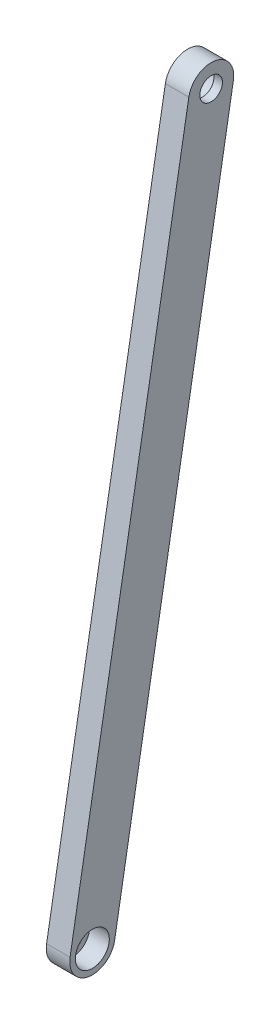
ISO-10303-21;
HEADER;
FILE_DESCRIPTION(('STEP AP214'),'2;1');
FILE_NAME('part.step','',(''),(''),'','','');
FILE_SCHEMA(('AUTOMOTIVE_DESIGN { 1 0 10303 214 1 1 1 1 }'));
ENDSEC;
DATA;
#1=APPLICATION_CONTEXT('core data for automotive mechanical design processes');
#2=APPLICATION_PROTOCOL_DEFINITION('international standard','automotive_design',2000,#1);
#3=PRODUCT_CONTEXT('',#1,'mechanical');
#4=PRODUCT('Part','Part','',(#3));
#5=PRODUCT_RELATED_PRODUCT_CATEGORY('part','',(#4));
#6=PRODUCT_DEFINITION_FORMATION('','',#4);
#7=PRODUCT_DEFINITION_CONTEXT('part definition',#1,'design');
#8=PRODUCT_DEFINITION('design','',#6,#7);
#9=PRODUCT_DEFINITION_SHAPE('','',#8);
#10=(LENGTH_UNIT() NAMED_UNIT(*) SI_UNIT(.MILLI.,.METRE.));
#11=(NAMED_UNIT(*) PLANE_ANGLE_UNIT() SI_UNIT($,.RADIAN.));
#12=(NAMED_UNIT(*) SI_UNIT($,.STERADIAN.) SOLID_ANGLE_UNIT());
#13=UNCERTAINTY_MEASURE_WITH_UNIT(LENGTH_MEASURE(1.E-05),#10,'distance_accuracy_value','');
#14=(GEOMETRIC_REPRESENTATION_CONTEXT(3) GLOBAL_UNCERTAINTY_ASSIGNED_CONTEXT((#13)) GLOBAL_UNIT_ASSIGNED_CONTEXT((#10,
#11,#12)) REPRESENTATION_CONTEXT('',''));
#15=CARTESIAN_POINT('',(0.,0.,0.));
#16=DIRECTION('',(0.,0.,1.));
#17=DIRECTION('',(1.,0.,0.));
#18=AXIS2_PLACEMENT_3D('',#15,#16,#17);
#19=CARTESIAN_POINT('',(-15.5,0.,0.));
#20=DIRECTION('',(1.,0.,0.));
#21=DIRECTION('',(0.,0.,-1.));
#22=AXIS2_PLACEMENT_3D('',#19,#20,#21);
#23=CYLINDRICAL_SURFACE('',#22,2.);
#24=CARTESIAN_POINT('',(-15.5,0.,0.));
#25=DIRECTION('',(1.,0.,0.));
#26=DIRECTION('',(0.,0.,-1.));
#27=AXIS2_PLACEMENT_3D('',#24,#25,#26);
#28=CIRCLE('',#27,2.);
#29=CARTESIAN_POINT('',(-15.5,0.,-2.));
#30=VERTEX_POINT('',#29);
#31=EDGE_CURVE('E106',#30,#30,#28,.T.);
#32=ORIENTED_EDGE('',*,*,#31,.F.);
#33=EDGE_LOOP('',(#32));
#34=FACE_BOUND('',#33,.T.);
#35=CARTESIAN_POINT('',(-14.8500000000001,0.,0.));
#36=DIRECTION('',(1.,0.,0.));
#37=DIRECTION('',(0.,0.,-1.));
#38=AXIS2_PLACEMENT_3D('',#35,#36,#37);
#39=CIRCLE('',#38,2.);
#40=CARTESIAN_POINT('',(-14.8500000000001,0.,-2.));
#41=VERTEX_POINT('',#40);
#42=EDGE_CURVE('E229',#41,#41,#39,.T.);
#43=ORIENTED_EDGE('',*,*,#42,.T.);
#44=EDGE_LOOP('',(#43));
#45=FACE_BOUND('',#44,.T.);
#46=ADVANCED_FACE('F41',(#34,#45),#23,.F.);
#47=CARTESIAN_POINT('',(-15.5,0.,0.));
#48=DIRECTION('',(1.,0.,0.));
#49=DIRECTION('',(0.,0.,-1.));
#50=AXIS2_PLACEMENT_3D('',#47,#48,#49);
#51=CYLINDRICAL_SURFACE('',#50,4.);
#52=CARTESIAN_POINT('',(-11.3500000000001,0.,0.));
#53=DIRECTION('',(1.,0.,0.));
#54=DIRECTION('',(0.,0.,-1.));
#55=AXIS2_PLACEMENT_3D('',#52,#53,#54);
#56=CIRCLE('',#55,4.);
#57=CARTESIAN_POINT('',(-11.3500000000001,-0.682894330608849,-3.94127585094247));
#58=VERTEX_POINT('',#57);
#59=CARTESIAN_POINT('',(-11.3500000000001,0.682894330608849,3.94127585094248));
#60=VERTEX_POINT('',#59);
#61=EDGE_CURVE('E112',#58,#60,#56,.F.);
#62=ORIENTED_EDGE('',*,*,#61,.T.);
#63=DIRECTION('',(1.,0.,0.));
#64=VECTOR('',#63,1.);
#65=CARTESIAN_POINT('',(-15.5,0.682894330608849,3.94127585094248));
#66=LINE('',#65,#64);
#67=CARTESIAN_POINT('',(-15.5,0.682894330608849,3.94127585094248));
#68=VERTEX_POINT('',#67);
#69=EDGE_CURVE('E11',#68,#60,#66,.T.);
#70=ORIENTED_EDGE('',*,*,#69,.F.);
#71=CARTESIAN_POINT('',(-15.5,0.,0.));
#72=DIRECTION('',(1.,0.,0.));
#73=DIRECTION('',(0.,0.,-1.));
#74=AXIS2_PLACEMENT_3D('',#71,#72,#73);
#75=CIRCLE('',#74,4.);
#76=CARTESIAN_POINT('',(-15.5,-0.682894330608849,-3.94127585094247));
#77=VERTEX_POINT('',#76);
#78=EDGE_CURVE('E101',#77,#68,#75,.F.);
#79=ORIENTED_EDGE('',*,*,#78,.F.);
#80=DIRECTION('',(1.,0.,0.));
#81=VECTOR('',#80,1.);
#82=CARTESIAN_POINT('',(-15.5,-0.682894330608849,-3.94127585094247));
#83=LINE('',#82,#81);
#84=EDGE_CURVE('E96',#77,#58,#83,.T.);
#85=ORIENTED_EDGE('',*,*,#84,.T.);
#86=EDGE_LOOP('',(#62,#70,#79,#85));
#87=FACE_BOUND('',#86,.T.);
#88=ADVANCED_FACE('F43',(#87),#51,.T.);
#89=CARTESIAN_POINT('',(-15.5,0.682894330608845,3.94127585094248));
#90=DIRECTION('',(0.,-0.170723582652211,-0.985318962735618));
#91=DIRECTION('',(0.,0.985318962735618,-0.170723582652211));
#92=AXIS2_PLACEMENT_3D('',#89,#90,#91);
#93=PLANE('',#92);
#94=DIRECTION('',(0.,0.985318962735618,-0.170723582652211));
#95=VECTOR('',#94,1.);
#96=CARTESIAN_POINT('',(-11.3500000000001,0.682894330608845,3.94127585094248));
#97=LINE('',#96,#95);
#98=CARTESIAN_POINT('',(-11.3500000000001,121.882894330609,-17.0587241490575));
#99=VERTEX_POINT('',#98);
#100=EDGE_CURVE('E81',#60,#99,#97,.T.);
#101=ORIENTED_EDGE('',*,*,#100,.T.);
#102=DIRECTION('',(1.,0.,0.));
#103=VECTOR('',#102,1.);
#104=CARTESIAN_POINT('',(-15.5,121.882894330609,-17.0587241490575));
#105=LINE('',#104,#103);
#106=CARTESIAN_POINT('',(-15.5,121.882894330609,-17.0587241490575));
#107=VERTEX_POINT('',#106);
#108=EDGE_CURVE('E51',#107,#99,#105,.T.);
#109=ORIENTED_EDGE('',*,*,#108,.F.);
#110=DIRECTION('',(0.,0.985318962735618,-0.170723582652211));
#111=VECTOR('',#110,1.);
#112=CARTESIAN_POINT('',(-15.5,0.682894330608845,3.94127585094248));
#113=LINE('',#112,#111);
#114=EDGE_CURVE('E59',#68,#107,#113,.T.);
#115=ORIENTED_EDGE('',*,*,#114,.F.);
#116=ORIENTED_EDGE('',*,*,#69,.T.);
#117=EDGE_LOOP('',(#101,#109,#115,#116));
#118=FACE_BOUND('',#117,.T.);
#119=ADVANCED_FACE('F144',(#118),#93,.F.);
#120=CARTESIAN_POINT('',(-15.5,121.2,-21.));
#121=DIRECTION('',(1.,0.,0.));
#122=DIRECTION('',(0.,0.,-1.));
#123=AXIS2_PLACEMENT_3D('',#120,#121,#122);
#124=CYLINDRICAL_SURFACE('',#123,4.00000000000001);
#125=CARTESIAN_POINT('',(-11.3500000000001,121.2,-21.));
#126=DIRECTION('',(1.,0.,0.));
#127=DIRECTION('',(0.,0.,-1.));
#128=AXIS2_PLACEMENT_3D('',#125,#126,#127);
#129=CIRCLE('',#128,4.00000000000001);
#130=CARTESIAN_POINT('',(-11.3500000000001,120.517105669391,-24.9412758509425));
#131=VERTEX_POINT('',#130);
#132=EDGE_CURVE('E93',#131,#99,#129,.T.);
#133=ORIENTED_EDGE('',*,*,#132,.F.);
#134=DIRECTION('',(1.,0.,0.));
#135=VECTOR('',#134,1.);
#136=CARTESIAN_POINT('',(-15.5,120.517105669391,-24.9412758509425));
#137=LINE('',#136,#135);
#138=CARTESIAN_POINT('',(-15.5,120.517105669391,-24.9412758509425));
#139=VERTEX_POINT('',#138);
#140=EDGE_CURVE('E90',#139,#131,#137,.T.);
#141=ORIENTED_EDGE('',*,*,#140,.F.);
#142=CARTESIAN_POINT('',(-15.5,121.2,-21.));
#143=DIRECTION('',(1.,0.,0.));
#144=DIRECTION('',(0.,0.,-1.));
#145=AXIS2_PLACEMENT_3D('',#142,#143,#144);
#146=CIRCLE('',#145,4.00000000000001);
#147=EDGE_CURVE('E92',#139,#107,#146,.T.);
#148=ORIENTED_EDGE('',*,*,#147,.T.);
#149=ORIENTED_EDGE('',*,*,#108,.T.);
#150=EDGE_LOOP('',(#133,#141,#148,#149));
#151=FACE_BOUND('',#150,.T.);
#152=ADVANCED_FACE('F91',(#151),#124,.T.);
#153=CARTESIAN_POINT('',(-15.5,-0.682894330608844,-3.94127585094247));
#154=DIRECTION('',(0.,0.170723582652211,0.985318962735618));
#155=DIRECTION('',(0.,-0.985318962735618,0.170723582652211));
#156=AXIS2_PLACEMENT_3D('',#153,#154,#155);
#157=PLANE('',#156);
#158=DIRECTION('',(0.,-0.985318962735618,0.170723582652211));
#159=VECTOR('',#158,1.);
#160=CARTESIAN_POINT('',(-11.3500000000001,-0.682894330608844,-3.94127585094247));
#161=LINE('',#160,#159);
#162=EDGE_CURVE('E115',#131,#58,#161,.T.);
#163=ORIENTED_EDGE('',*,*,#162,.T.);
#164=ORIENTED_EDGE('',*,*,#84,.F.);
#165=DIRECTION('',(0.,-0.985318962735618,0.170723582652211));
#166=VECTOR('',#165,1.);
#167=CARTESIAN_POINT('',(-15.5,-0.682894330608844,-3.94127585094247));
#168=LINE('',#167,#166);
#169=EDGE_CURVE('E87',#139,#77,#168,.T.);
#170=ORIENTED_EDGE('',*,*,#169,.F.);
#171=ORIENTED_EDGE('',*,*,#140,.T.);
#172=EDGE_LOOP('',(#163,#164,#170,#171));
#173=FACE_BOUND('',#172,.T.);
#174=ADVANCED_FACE('F98',(#173),#157,.F.);
#175=CARTESIAN_POINT('',(-15.5,0.,0.));
#176=DIRECTION('',(1.,0.,0.));
#177=DIRECTION('',(0.,0.,-1.));
#178=AXIS2_PLACEMENT_3D('',#175,#176,#177);
#179=PLANE('',#178);
#180=CARTESIAN_POINT('',(-15.5,121.2,-21.));
#181=DIRECTION('',(1.,0.,0.));
#182=DIRECTION('',(0.,0.,-1.));
#183=AXIS2_PLACEMENT_3D('',#180,#181,#182);
#184=CIRCLE('',#183,3.);
#185=CARTESIAN_POINT('',(-15.5,121.2,-24.));
#186=VERTEX_POINT('',#185);
#187=EDGE_CURVE('E244',#186,#186,#184,.T.);
#188=ORIENTED_EDGE('',*,*,#187,.T.);
#189=EDGE_LOOP('',(#188));
#190=FACE_BOUND('',#189,.T.);
#191=ORIENTED_EDGE('',*,*,#78,.T.);
#192=ORIENTED_EDGE('',*,*,#114,.T.);
#193=ORIENTED_EDGE('',*,*,#147,.F.);
#194=ORIENTED_EDGE('',*,*,#169,.T.);
#195=EDGE_LOOP('',(#191,#192,#193,#194));
#196=FACE_BOUND('',#195,.T.);
#197=ORIENTED_EDGE('',*,*,#31,.T.);
#198=EDGE_LOOP('',(#197));
#199=FACE_BOUND('',#198,.T.);
#200=ADVANCED_FACE('F103',(#190,#196,#199),#179,.F.);
#201=CARTESIAN_POINT('',(-11.3500000000001,0.,0.));
#202=DIRECTION('',(1.,0.,0.));
#203=DIRECTION('',(0.,0.,-1.));
#204=AXIS2_PLACEMENT_3D('',#201,#202,#203);
#205=PLANE('',#204);
#206=CARTESIAN_POINT('',(-11.3500000000001,0.,0.));
#207=DIRECTION('',(1.,0.,0.));
#208=DIRECTION('',(0.,0.,-1.));
#209=AXIS2_PLACEMENT_3D('',#206,#207,#208);
#210=CIRCLE('',#209,3.);
#211=CARTESIAN_POINT('',(-11.3500000000001,0.,-3.));
#212=VERTEX_POINT('',#211);
#213=EDGE_CURVE('E237',#212,#212,#210,.T.);
#214=ORIENTED_EDGE('',*,*,#213,.F.);
#215=EDGE_LOOP('',(#214));
#216=FACE_BOUND('',#215,.T.);
#217=CARTESIAN_POINT('',(-11.3500000000001,121.2,-21.));
#218=DIRECTION('',(1.,0.,0.));
#219=DIRECTION('',(0.,0.,-1.));
#220=AXIS2_PLACEMENT_3D('',#217,#218,#219);
#221=CIRCLE('',#220,2.);
#222=CARTESIAN_POINT('',(-11.3500000000001,121.2,-23.));
#223=VERTEX_POINT('',#222);
#224=EDGE_CURVE('E233',#223,#223,#221,.T.);
#225=ORIENTED_EDGE('',*,*,#224,.F.);
#226=EDGE_LOOP('',(#225));
#227=FACE_BOUND('',#226,.T.);
#228=ORIENTED_EDGE('',*,*,#61,.F.);
#229=ORIENTED_EDGE('',*,*,#162,.F.);
#230=ORIENTED_EDGE('',*,*,#132,.T.);
#231=ORIENTED_EDGE('',*,*,#100,.F.);
#232=EDGE_LOOP('',(#228,#229,#230,#231));
#233=FACE_BOUND('',#232,.T.);
#234=ADVANCED_FACE('F122',(#216,#227,#233),#205,.T.);
#235=CARTESIAN_POINT('',(-12.8500000000001,121.2,-21.));
#236=DIRECTION('',(-1.,0.,0.));
#237=DIRECTION('',(0.,0.,1.));
#238=AXIS2_PLACEMENT_3D('',#235,#236,#237);
#239=CYLINDRICAL_SURFACE('',#238,3.);
#240=CARTESIAN_POINT('',(-12.8500000000001,121.2,-21.));
#241=DIRECTION('',(1.,0.,0.));
#242=DIRECTION('',(0.,0.,-1.));
#243=AXIS2_PLACEMENT_3D('',#240,#241,#242);
#244=CIRCLE('',#243,3.);
#245=CARTESIAN_POINT('',(-12.8500000000001,121.2,-24.));
#246=VERTEX_POINT('',#245);
#247=EDGE_CURVE('E116',#246,#246,#244,.T.);
#248=ORIENTED_EDGE('',*,*,#247,.T.);
#249=EDGE_LOOP('',(#248));
#250=FACE_BOUND('',#249,.T.);
#251=ORIENTED_EDGE('',*,*,#187,.F.);
#252=EDGE_LOOP('',(#251));
#253=FACE_BOUND('',#252,.T.);
#254=ADVANCED_FACE('F124',(#250,#253),#239,.F.);
#255=CARTESIAN_POINT('',(-12.8500000000001,0.,0.));
#256=DIRECTION('',(1.,0.,0.));
#257=DIRECTION('',(0.,0.,-1.));
#258=AXIS2_PLACEMENT_3D('',#255,#256,#257);
#259=PLANE('',#258);
#260=CARTESIAN_POINT('',(-12.8500000000001,121.2,-21.));
#261=DIRECTION('',(1.,0.,0.));
#262=DIRECTION('',(0.,0.,-1.));
#263=AXIS2_PLACEMENT_3D('',#260,#261,#262);
#264=CIRCLE('',#263,2.);
#265=CARTESIAN_POINT('',(-12.8500000000001,121.2,-23.));
#266=VERTEX_POINT('',#265);
#267=EDGE_CURVE('E45',#266,#266,#264,.F.);
#268=ORIENTED_EDGE('',*,*,#267,.F.);
#269=EDGE_LOOP('',(#268));
#270=FACE_BOUND('',#269,.T.);
#271=ORIENTED_EDGE('',*,*,#247,.F.);
#272=EDGE_LOOP('',(#271));
#273=FACE_BOUND('',#272,.T.);
#274=ADVANCED_FACE('F131',(#270,#273),#259,.F.);
#275=CARTESIAN_POINT('',(-11.3500000000001,121.2,-21.));
#276=DIRECTION('',(-1.,0.,0.));
#277=DIRECTION('',(0.,0.,1.));
#278=AXIS2_PLACEMENT_3D('',#275,#276,#277);
#279=CYLINDRICAL_SURFACE('',#278,2.);
#280=ORIENTED_EDGE('',*,*,#224,.T.);
#281=EDGE_LOOP('',(#280));
#282=FACE_BOUND('',#281,.T.);
#283=ORIENTED_EDGE('',*,*,#267,.T.);
#284=EDGE_LOOP('',(#283));
#285=FACE_BOUND('',#284,.T.);
#286=ADVANCED_FACE('F179',(#282,#285),#279,.F.);
#287=CARTESIAN_POINT('',(-14.8500000000001,0.,0.));
#288=DIRECTION('',(1.,0.,0.));
#289=DIRECTION('',(0.,0.,-1.));
#290=AXIS2_PLACEMENT_3D('',#287,#288,#289);
#291=CYLINDRICAL_SURFACE('',#290,3.);
#292=CARTESIAN_POINT('',(-14.8500000000001,0.,0.));
#293=DIRECTION('',(1.,0.,0.));
#294=DIRECTION('',(0.,0.,-1.));
#295=AXIS2_PLACEMENT_3D('',#292,#293,#294);
#296=CIRCLE('',#295,3.);
#297=CARTESIAN_POINT('',(-14.8500000000001,0.,-3.));
#298=VERTEX_POINT('',#297);
#299=EDGE_CURVE('E232',#298,#298,#296,.T.);
#300=CARTESIAN_POINT('',(-14.8500000000001,0.,-3.));
#301=CARTESIAN_POINT('',(-14.8135416666667,0.,-3.));
#302=CARTESIAN_POINT('',(-14.7770833333334,0.,-3.));
#303=CARTESIAN_POINT('',(-14.7041666666667,0.,-3.));
#304=CARTESIAN_POINT('',(-14.6677083333334,0.,-3.));
#305=CARTESIAN_POINT('',(-14.5947916666667,0.,-3.));
#306=CARTESIAN_POINT('',(-14.5583333333334,0.,-3.));
#307=CARTESIAN_POINT('',(-14.4854166666667,0.,-3.));
#308=CARTESIAN_POINT('',(-14.4489583333334,0.,-3.));
#309=CARTESIAN_POINT('',(-14.3760416666667,0.,-3.));
#310=CARTESIAN_POINT('',(-14.3395833333334,0.,-3.));
#311=CARTESIAN_POINT('',(-14.2666666666667,0.,-3.));
#312=CARTESIAN_POINT('',(-14.2302083333334,0.,-3.));
#313=CARTESIAN_POINT('',(-14.1572916666667,0.,-3.));
#314=CARTESIAN_POINT('',(-14.1208333333334,0.,-3.));
#315=CARTESIAN_POINT('',(-14.0479166666667,0.,-3.));
#316=CARTESIAN_POINT('',(-14.0114583333334,0.,-3.));
#317=CARTESIAN_POINT('',(-13.9385416666667,0.,-3.));
#318=CARTESIAN_POINT('',(-13.9020833333334,0.,-3.));
#319=CARTESIAN_POINT('',(-13.8291666666667,0.,-3.));
#320=CARTESIAN_POINT('',(-13.7927083333334,0.,-3.));
#321=CARTESIAN_POINT('',(-13.7197916666667,0.,-3.));
#322=CARTESIAN_POINT('',(-13.6833333333334,0.,-3.));
#323=CARTESIAN_POINT('',(-13.6104166666667,0.,-3.));
#324=CARTESIAN_POINT('',(-13.5739583333334,0.,-3.));
#325=CARTESIAN_POINT('',(-13.5010416666667,0.,-3.));
#326=CARTESIAN_POINT('',(-13.4645833333334,0.,-3.));
#327=CARTESIAN_POINT('',(-13.3916666666667,0.,-3.));
#328=CARTESIAN_POINT('',(-13.3552083333334,0.,-3.));
#329=CARTESIAN_POINT('',(-13.2822916666667,0.,-3.));
#330=CARTESIAN_POINT('',(-13.2458333333334,0.,-3.));
#331=CARTESIAN_POINT('',(-13.1729166666667,0.,-3.));
#332=CARTESIAN_POINT('',(-13.1364583333334,0.,-3.));
#333=CARTESIAN_POINT('',(-13.0635416666667,0.,-3.));
#334=CARTESIAN_POINT('',(-13.0270833333334,0.,-3.));
#335=CARTESIAN_POINT('',(-12.9541666666667,0.,-3.));
#336=CARTESIAN_POINT('',(-12.9177083333334,0.,-3.));
#337=CARTESIAN_POINT('',(-12.8447916666667,0.,-3.));
#338=CARTESIAN_POINT('',(-12.8083333333334,0.,-3.));
#339=CARTESIAN_POINT('',(-12.7354166666667,0.,-3.));
#340=CARTESIAN_POINT('',(-12.6989583333334,0.,-3.));
#341=CARTESIAN_POINT('',(-12.6260416666667,0.,-3.));
#342=CARTESIAN_POINT('',(-12.5895833333334,0.,-3.));
#343=CARTESIAN_POINT('',(-12.5166666666667,0.,-3.));
#344=CARTESIAN_POINT('',(-12.4802083333334,0.,-3.));
#345=CARTESIAN_POINT('',(-12.4072916666667,0.,-3.));
#346=CARTESIAN_POINT('',(-12.3708333333334,0.,-3.));
#347=CARTESIAN_POINT('',(-12.2979166666667,0.,-3.));
#348=CARTESIAN_POINT('',(-12.2614583333334,0.,-3.));
#349=CARTESIAN_POINT('',(-12.1885416666667,0.,-3.));
#350=CARTESIAN_POINT('',(-12.1520833333334,0.,-3.));
#351=CARTESIAN_POINT('',(-12.0791666666667,0.,-3.));
#352=CARTESIAN_POINT('',(-12.0427083333334,0.,-3.));
#353=CARTESIAN_POINT('',(-11.9697916666667,0.,-3.));
#354=CARTESIAN_POINT('',(-11.9333333333334,0.,-3.));
#355=CARTESIAN_POINT('',(-11.8604166666667,0.,-3.));
#356=CARTESIAN_POINT('',(-11.8239583333334,0.,-3.));
#357=CARTESIAN_POINT('',(-11.7510416666667,0.,-3.));
#358=CARTESIAN_POINT('',(-11.7145833333334,0.,-3.));
#359=CARTESIAN_POINT('',(-11.6416666666667,0.,-3.));
#360=CARTESIAN_POINT('',(-11.6052083333334,0.,-3.));
#361=CARTESIAN_POINT('',(-11.5322916666667,0.,-3.));
#362=CARTESIAN_POINT('',(-11.4958333333334,0.,-3.));
#363=CARTESIAN_POINT('',(-11.4229166666667,0.,-3.));
#364=CARTESIAN_POINT('',(-11.3864583333334,0.,-3.));
#365=CARTESIAN_POINT('',(-11.3500000000001,0.,-3.));
#366=B_SPLINE_CURVE_WITH_KNOTS('',3,(#300,#301,#302,#303,#304,#305,#306,#307,#308,#309,#310,
#311,#312,#313,#314,#315,#316,#317,#318,#319,#320,#321,#322,#323,#324,#325,#326,#327,#328,#329,
#330,#331,#332,#333,#334,#335,#336,#337,#338,#339,#340,#341,#342,#343,#344,#345,#346,#347,#348,
#349,#350,#351,#352,#353,#354,#355,#356,#357,#358,#359,#360,#361,#362,#363,#364,#365),
.UNSPECIFIED.,.F.,.F.,(4,2,2,2,2,2,2,2,2,2,2,2,2,2,2,2,2,2,2,2,2,2,2,2,2,2,2,2,2,2,2,2,4),(0.,
0.109375,0.21875,0.328125,0.4375,0.546875,0.656250000000001,0.765625000000001,0.875000000000001,
0.984375000000001,1.09375,1.203125,1.3125,1.421875,1.53125,1.640625,1.75,1.859375,1.96875,
2.078125,2.1875,2.296875,2.40625,2.515625,2.625,2.734375,2.84375,2.953125,3.0625,3.171875,
3.28125,3.390625,3.5),.UNSPECIFIED.);
#367=EDGE_CURVE('BSEAM189',#298,#212,#366,.T.);
#368=ORIENTED_EDGE('',*,*,#299,.F.);
#369=ORIENTED_EDGE('',*,*,#213,.T.);
#370=ORIENTED_EDGE('',*,*,#367,.T.);
#371=ORIENTED_EDGE('',*,*,#367,.F.);
#372=EDGE_LOOP('',(#368,#370,#369,#371));
#373=FACE_BOUND('',#372,.T.);
#374=ADVANCED_FACE('F189',(#373),#291,.F.);
#375=CARTESIAN_POINT('',(-14.8500000000001,0.,0.));
#376=DIRECTION('',(1.,0.,0.));
#377=DIRECTION('',(0.,0.,-1.));
#378=AXIS2_PLACEMENT_3D('',#375,#376,#377);
#379=PLANE('',#378);
#380=ORIENTED_EDGE('',*,*,#42,.F.);
#381=EDGE_LOOP('',(#380));
#382=FACE_BOUND('',#381,.T.);
#383=ORIENTED_EDGE('',*,*,#299,.T.);
#384=EDGE_LOOP('',(#383));
#385=FACE_BOUND('',#384,.T.);
#386=ADVANCED_FACE('F209',(#382,#385),#379,.T.);
#387=CLOSED_SHELL('',(#46,#88,#119,#152,#174,#200,#234,#254,#274,#286,#374,#386));
#388=MANIFOLD_SOLID_BREP('B2',#387);
#389=ADVANCED_BREP_SHAPE_REPRESENTATION('',(#18,#388),#14);
#390=SHAPE_DEFINITION_REPRESENTATION(#9,#389);
ENDSEC;
END-ISO-10303-21;
